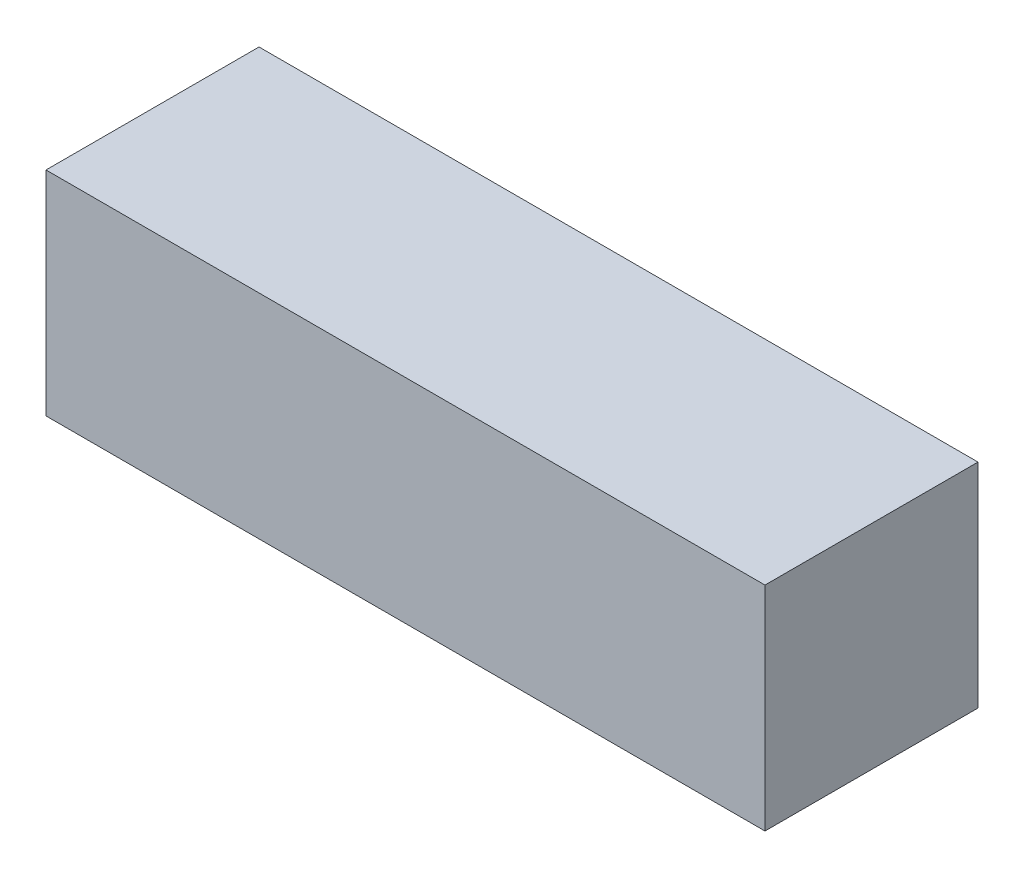
ISO-10303-21;
HEADER;
FILE_DESCRIPTION(('STEP AP214'),'2;1');
FILE_NAME('part.step','',(''),(''),'','','');
FILE_SCHEMA(('AUTOMOTIVE_DESIGN { 1 0 10303 214 1 1 1 1 }'));
ENDSEC;
DATA;
#1=APPLICATION_CONTEXT('core data for automotive mechanical design processes');
#2=APPLICATION_PROTOCOL_DEFINITION('international standard','automotive_design',2000,#1);
#3=PRODUCT_CONTEXT('',#1,'mechanical');
#4=PRODUCT('Part','Part','',(#3));
#5=PRODUCT_RELATED_PRODUCT_CATEGORY('part','',(#4));
#6=PRODUCT_DEFINITION_FORMATION('','',#4);
#7=PRODUCT_DEFINITION_CONTEXT('part definition',#1,'design');
#8=PRODUCT_DEFINITION('design','',#6,#7);
#9=PRODUCT_DEFINITION_SHAPE('','',#8);
#10=(LENGTH_UNIT() NAMED_UNIT(*) SI_UNIT(.MILLI.,.METRE.));
#11=(NAMED_UNIT(*) PLANE_ANGLE_UNIT() SI_UNIT($,.RADIAN.));
#12=(NAMED_UNIT(*) SI_UNIT($,.STERADIAN.) SOLID_ANGLE_UNIT());
#13=UNCERTAINTY_MEASURE_WITH_UNIT(LENGTH_MEASURE(1.E-05),#10,'distance_accuracy_value','');
#14=(GEOMETRIC_REPRESENTATION_CONTEXT(3) GLOBAL_UNCERTAINTY_ASSIGNED_CONTEXT((#13)) GLOBAL_UNIT_ASSIGNED_CONTEXT((#10,
#11,#12)) REPRESENTATION_CONTEXT('',''));
#15=CARTESIAN_POINT('',(0.,0.,0.));
#16=DIRECTION('',(0.,0.,1.));
#17=DIRECTION('',(1.,0.,0.));
#18=AXIS2_PLACEMENT_3D('',#15,#16,#17);
#19=CARTESIAN_POINT('',(-85.725,25.4,50.8));
#20=DIRECTION('',(1.,0.,0.));
#21=DIRECTION('',(0.,0.,-1.));
#22=AXIS2_PLACEMENT_3D('',#19,#20,#21);
#23=PLANE('',#22);
#24=DIRECTION('',(0.,-1.,0.));
#25=VECTOR('',#24,1.);
#26=CARTESIAN_POINT('',(-85.725,25.4,0.));
#27=LINE('',#26,#25);
#28=CARTESIAN_POINT('',(-85.725,25.4,0.));
#29=VERTEX_POINT('',#28);
#30=CARTESIAN_POINT('',(-85.725,-25.4,0.));
#31=VERTEX_POINT('',#30);
#32=EDGE_CURVE('E95',#29,#31,#27,.T.);
#33=ORIENTED_EDGE('',*,*,#32,.T.);
#34=DIRECTION('',(0.,0.,-1.));
#35=VECTOR('',#34,1.);
#36=CARTESIAN_POINT('',(-85.725,-25.4,50.8));
#37=LINE('',#36,#35);
#38=CARTESIAN_POINT('',(-85.725,-25.4,50.8));
#39=VERTEX_POINT('',#38);
#40=EDGE_CURVE('E11',#39,#31,#37,.T.);
#41=ORIENTED_EDGE('',*,*,#40,.F.);
#42=DIRECTION('',(0.,-1.,0.));
#43=VECTOR('',#42,1.);
#44=CARTESIAN_POINT('',(-85.725,25.4,50.8));
#45=LINE('',#44,#43);
#46=CARTESIAN_POINT('',(-85.725,25.4,50.8));
#47=VERTEX_POINT('',#46);
#48=EDGE_CURVE('E83',#47,#39,#45,.T.);
#49=ORIENTED_EDGE('',*,*,#48,.F.);
#50=DIRECTION('',(0.,0.,-1.));
#51=VECTOR('',#50,1.);
#52=CARTESIAN_POINT('',(-85.725,25.4,50.8));
#53=LINE('',#52,#51);
#54=EDGE_CURVE('E91',#47,#29,#53,.T.);
#55=ORIENTED_EDGE('',*,*,#54,.T.);
#56=EDGE_LOOP('',(#33,#41,#49,#55));
#57=FACE_BOUND('',#56,.T.);
#58=ADVANCED_FACE('F32',(#57),#23,.F.);
#59=CARTESIAN_POINT('',(-85.725,-25.4,50.8));
#60=DIRECTION('',(0.,1.,0.));
#61=DIRECTION('',(0.,0.,1.));
#62=AXIS2_PLACEMENT_3D('',#59,#60,#61);
#63=PLANE('',#62);
#64=DIRECTION('',(1.,0.,0.));
#65=VECTOR('',#64,1.);
#66=CARTESIAN_POINT('',(-85.725,-25.4,0.));
#67=LINE('',#66,#65);
#68=CARTESIAN_POINT('',(85.725,-25.4,0.));
#69=VERTEX_POINT('',#68);
#70=EDGE_CURVE('E87',#31,#69,#67,.T.);
#71=ORIENTED_EDGE('',*,*,#70,.T.);
#72=DIRECTION('',(0.,0.,-1.));
#73=VECTOR('',#72,1.);
#74=CARTESIAN_POINT('',(85.725,-25.4,50.8));
#75=LINE('',#74,#73);
#76=CARTESIAN_POINT('',(85.725,-25.4,50.8));
#77=VERTEX_POINT('',#76);
#78=EDGE_CURVE('E40',#77,#69,#75,.T.);
#79=ORIENTED_EDGE('',*,*,#78,.F.);
#80=DIRECTION('',(1.,0.,0.));
#81=VECTOR('',#80,1.);
#82=CARTESIAN_POINT('',(-85.725,-25.4,50.8));
#83=LINE('',#82,#81);
#84=EDGE_CURVE('E78',#39,#77,#83,.T.);
#85=ORIENTED_EDGE('',*,*,#84,.F.);
#86=ORIENTED_EDGE('',*,*,#40,.T.);
#87=EDGE_LOOP('',(#71,#79,#85,#86));
#88=FACE_BOUND('',#87,.T.);
#89=ADVANCED_FACE('F86',(#88),#63,.F.);
#90=CARTESIAN_POINT('',(85.725,25.4,50.8));
#91=DIRECTION('',(-1.,0.,0.));
#92=DIRECTION('',(0.,0.,1.));
#93=AXIS2_PLACEMENT_3D('',#90,#91,#92);
#94=PLANE('',#93);
#95=DIRECTION('',(0.,1.,0.));
#96=VECTOR('',#95,1.);
#97=CARTESIAN_POINT('',(85.725,25.4,0.));
#98=LINE('',#97,#96);
#99=CARTESIAN_POINT('',(85.725,25.4,0.));
#100=VERTEX_POINT('',#99);
#101=EDGE_CURVE('E65',#69,#100,#98,.T.);
#102=ORIENTED_EDGE('',*,*,#101,.T.);
#103=DIRECTION('',(0.,0.,-1.));
#104=VECTOR('',#103,1.);
#105=CARTESIAN_POINT('',(85.725,25.4,50.8));
#106=LINE('',#105,#104);
#107=CARTESIAN_POINT('',(85.725,25.4,50.8));
#108=VERTEX_POINT('',#107);
#109=EDGE_CURVE('E88',#108,#100,#106,.T.);
#110=ORIENTED_EDGE('',*,*,#109,.F.);
#111=DIRECTION('',(0.,1.,0.));
#112=VECTOR('',#111,1.);
#113=CARTESIAN_POINT('',(85.725,25.4,50.8));
#114=LINE('',#113,#112);
#115=EDGE_CURVE('E81',#77,#108,#114,.T.);
#116=ORIENTED_EDGE('',*,*,#115,.F.);
#117=ORIENTED_EDGE('',*,*,#78,.T.);
#118=EDGE_LOOP('',(#102,#110,#116,#117));
#119=FACE_BOUND('',#118,.T.);
#120=ADVANCED_FACE('F89',(#119),#94,.F.);
#121=CARTESIAN_POINT('',(-85.725,25.4,50.8));
#122=DIRECTION('',(0.,-1.,0.));
#123=DIRECTION('',(0.,0.,-1.));
#124=AXIS2_PLACEMENT_3D('',#121,#122,#123);
#125=PLANE('',#124);
#126=DIRECTION('',(-1.,0.,0.));
#127=VECTOR('',#126,1.);
#128=CARTESIAN_POINT('',(-85.725,25.4,0.));
#129=LINE('',#128,#127);
#130=EDGE_CURVE('E71',#100,#29,#129,.T.);
#131=ORIENTED_EDGE('',*,*,#130,.T.);
#132=ORIENTED_EDGE('',*,*,#54,.F.);
#133=DIRECTION('',(-1.,0.,0.));
#134=VECTOR('',#133,1.);
#135=CARTESIAN_POINT('',(-85.725,25.4,50.8));
#136=LINE('',#135,#134);
#137=EDGE_CURVE('E48',#108,#47,#136,.T.);
#138=ORIENTED_EDGE('',*,*,#137,.F.);
#139=ORIENTED_EDGE('',*,*,#109,.T.);
#140=EDGE_LOOP('',(#131,#132,#138,#139));
#141=FACE_BOUND('',#140,.T.);
#142=ADVANCED_FACE('F102',(#141),#125,.F.);
#143=CARTESIAN_POINT('',(0.,0.,50.8));
#144=DIRECTION('',(0.,0.,1.));
#145=DIRECTION('',(1.,0.,0.));
#146=AXIS2_PLACEMENT_3D('',#143,#144,#145);
#147=PLANE('',#146);
#148=ORIENTED_EDGE('',*,*,#48,.T.);
#149=ORIENTED_EDGE('',*,*,#84,.T.);
#150=ORIENTED_EDGE('',*,*,#115,.T.);
#151=ORIENTED_EDGE('',*,*,#137,.T.);
#152=EDGE_LOOP('',(#148,#149,#150,#151));
#153=FACE_BOUND('',#152,.T.);
#154=ADVANCED_FACE('F79',(#153),#147,.T.);
#155=CARTESIAN_POINT('',(0.,0.,0.));
#156=DIRECTION('',(0.,0.,1.));
#157=DIRECTION('',(1.,0.,0.));
#158=AXIS2_PLACEMENT_3D('',#155,#156,#157);
#159=PLANE('',#158);
#160=ORIENTED_EDGE('',*,*,#32,.F.);
#161=ORIENTED_EDGE('',*,*,#130,.F.);
#162=ORIENTED_EDGE('',*,*,#101,.F.);
#163=ORIENTED_EDGE('',*,*,#70,.F.);
#164=EDGE_LOOP('',(#160,#161,#162,#163));
#165=FACE_BOUND('',#164,.T.);
#166=ADVANCED_FACE('F105',(#165),#159,.F.);
#167=CLOSED_SHELL('',(#58,#89,#120,#142,#154,#166));
#168=MANIFOLD_SOLID_BREP('B2',#167);
#169=ADVANCED_BREP_SHAPE_REPRESENTATION('',(#18,#168),#14);
#170=SHAPE_DEFINITION_REPRESENTATION(#9,#169);
ENDSEC;
END-ISO-10303-21;
